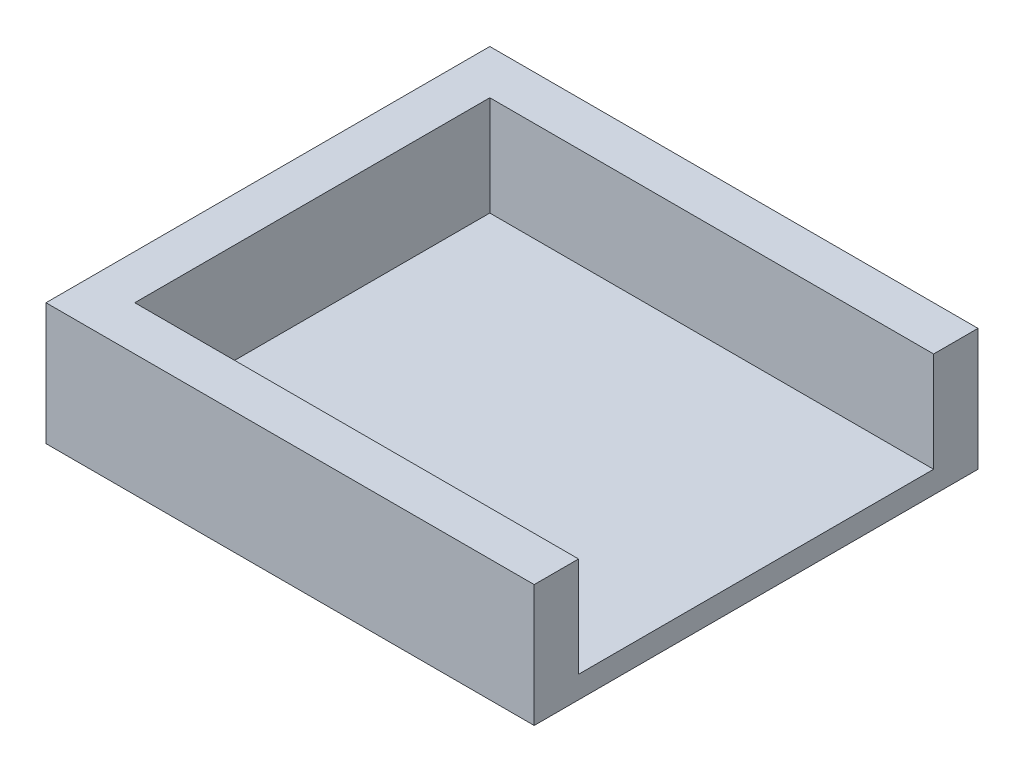
ISO-10303-21;
HEADER;
FILE_DESCRIPTION(('STEP AP214'),'2;1');
FILE_NAME('part.step','',(''),(''),'','','');
FILE_SCHEMA(('AUTOMOTIVE_DESIGN { 1 0 10303 214 1 1 1 1 }'));
ENDSEC;
DATA;
#1=APPLICATION_CONTEXT('core data for automotive mechanical design processes');
#2=APPLICATION_PROTOCOL_DEFINITION('international standard','automotive_design',2000,#1);
#3=PRODUCT_CONTEXT('',#1,'mechanical');
#4=PRODUCT('Part','Part','',(#3));
#5=PRODUCT_RELATED_PRODUCT_CATEGORY('part','',(#4));
#6=PRODUCT_DEFINITION_FORMATION('','',#4);
#7=PRODUCT_DEFINITION_CONTEXT('part definition',#1,'design');
#8=PRODUCT_DEFINITION('design','',#6,#7);
#9=PRODUCT_DEFINITION_SHAPE('','',#8);
#10=(LENGTH_UNIT() NAMED_UNIT(*) SI_UNIT(.MILLI.,.METRE.));
#11=(NAMED_UNIT(*) PLANE_ANGLE_UNIT() SI_UNIT($,.RADIAN.));
#12=(NAMED_UNIT(*) SI_UNIT($,.STERADIAN.) SOLID_ANGLE_UNIT());
#13=UNCERTAINTY_MEASURE_WITH_UNIT(LENGTH_MEASURE(1.E-05),#10,'distance_accuracy_value','');
#14=(GEOMETRIC_REPRESENTATION_CONTEXT(3) GLOBAL_UNCERTAINTY_ASSIGNED_CONTEXT((#13)) GLOBAL_UNIT_ASSIGNED_CONTEXT((#10,
#11,#12)) REPRESENTATION_CONTEXT('',''));
#15=CARTESIAN_POINT('',(0.,0.,0.));
#16=DIRECTION('',(0.,0.,1.));
#17=DIRECTION('',(1.,0.,0.));
#18=AXIS2_PLACEMENT_3D('',#15,#16,#17);
#19=CARTESIAN_POINT('',(-90.,45.,80.));
#20=DIRECTION('',(-1.,0.,0.));
#21=DIRECTION('',(0.,0.,1.));
#22=AXIS2_PLACEMENT_3D('',#19,#20,#21);
#23=PLANE('',#22);
#24=DIRECTION('',(0.,0.,-1.));
#25=VECTOR('',#24,1.);
#26=CARTESIAN_POINT('',(-90.,0.,80.));
#27=LINE('',#26,#25);
#28=CARTESIAN_POINT('',(-90.,0.,80.));
#29=VERTEX_POINT('',#28);
#30=CARTESIAN_POINT('',(-90.,0.,-80.));
#31=VERTEX_POINT('',#30);
#32=EDGE_CURVE('E125',#29,#31,#27,.T.);
#33=ORIENTED_EDGE('',*,*,#32,.T.);
#34=DIRECTION('',(0.,-1.,0.));
#35=VECTOR('',#34,1.);
#36=CARTESIAN_POINT('',(-90.,45.,-80.));
#37=LINE('',#36,#35);
#38=CARTESIAN_POINT('',(-90.,45.,-80.));
#39=VERTEX_POINT('',#38);
#40=EDGE_CURVE('E11',#39,#31,#37,.T.);
#41=ORIENTED_EDGE('',*,*,#40,.F.);
#42=DIRECTION('',(0.,0.,-1.));
#43=VECTOR('',#42,1.);
#44=CARTESIAN_POINT('',(-90.,45.,80.));
#45=LINE('',#44,#43);
#46=CARTESIAN_POINT('',(-90.,45.,80.));
#47=VERTEX_POINT('',#46);
#48=EDGE_CURVE('E127',#47,#39,#45,.T.);
#49=ORIENTED_EDGE('',*,*,#48,.F.);
#50=DIRECTION('',(0.,-1.,0.));
#51=VECTOR('',#50,1.);
#52=CARTESIAN_POINT('',(-90.,45.,80.));
#53=LINE('',#52,#51);
#54=EDGE_CURVE('E142',#47,#29,#53,.T.);
#55=ORIENTED_EDGE('',*,*,#54,.T.);
#56=EDGE_LOOP('',(#33,#41,#49,#55));
#57=FACE_BOUND('',#56,.T.);
#58=ADVANCED_FACE('F33',(#57),#23,.F.);
#59=CARTESIAN_POINT('',(-90.,45.,-80.));
#60=DIRECTION('',(0.,0.,-1.));
#61=DIRECTION('',(-1.,0.,0.));
#62=AXIS2_PLACEMENT_3D('',#59,#60,#61);
#63=PLANE('',#62);
#64=DIRECTION('',(1.,0.,0.));
#65=VECTOR('',#64,1.);
#66=CARTESIAN_POINT('',(-90.,0.,-80.));
#67=LINE('',#66,#65);
#68=CARTESIAN_POINT('',(110.,0.,-80.));
#69=VERTEX_POINT('',#68);
#70=EDGE_CURVE('E145',#31,#69,#67,.T.);
#71=ORIENTED_EDGE('',*,*,#70,.T.);
#72=DIRECTION('',(0.,-1.,0.));
#73=VECTOR('',#72,1.);
#74=CARTESIAN_POINT('',(110.,45.,-80.));
#75=LINE('',#74,#73);
#76=CARTESIAN_POINT('',(110.,45.,-80.));
#77=VERTEX_POINT('',#76);
#78=EDGE_CURVE('E41',#77,#69,#75,.T.);
#79=ORIENTED_EDGE('',*,*,#78,.F.);
#80=DIRECTION('',(1.,0.,0.));
#81=VECTOR('',#80,1.);
#82=CARTESIAN_POINT('',(-90.,45.,-80.));
#83=LINE('',#82,#81);
#84=EDGE_CURVE('E129',#39,#77,#83,.T.);
#85=ORIENTED_EDGE('',*,*,#84,.F.);
#86=ORIENTED_EDGE('',*,*,#40,.T.);
#87=EDGE_LOOP('',(#71,#79,#85,#86));
#88=FACE_BOUND('',#87,.T.);
#89=ADVANCED_FACE('F166',(#88),#63,.F.);
#90=CARTESIAN_POINT('',(-110.,45.,-100.));
#91=DIRECTION('',(0.,0.,1.));
#92=DIRECTION('',(1.,0.,0.));
#93=AXIS2_PLACEMENT_3D('',#90,#91,#92);
#94=PLANE('',#93);
#95=DIRECTION('',(0.,-1.,0.));
#96=VECTOR('',#95,1.);
#97=CARTESIAN_POINT('',(110.,45.,-100.));
#98=LINE('',#97,#96);
#99=CARTESIAN_POINT('',(110.,45.,-100.));
#100=VERTEX_POINT('',#99);
#101=CARTESIAN_POINT('',(110.,-10.,-100.));
#102=VERTEX_POINT('',#101);
#103=EDGE_CURVE('E103',#100,#102,#98,.T.);
#104=ORIENTED_EDGE('',*,*,#103,.T.);
#105=DIRECTION('',(1.,0.,0.));
#106=VECTOR('',#105,1.);
#107=CARTESIAN_POINT('',(-110.,-10.,-100.));
#108=LINE('',#107,#106);
#109=CARTESIAN_POINT('',(-110.,-10.,-100.));
#110=VERTEX_POINT('',#109);
#111=EDGE_CURVE('E107',#110,#102,#108,.T.);
#112=ORIENTED_EDGE('',*,*,#111,.F.);
#113=DIRECTION('',(0.,-1.,0.));
#114=VECTOR('',#113,1.);
#115=CARTESIAN_POINT('',(-110.,45.,-100.));
#116=LINE('',#115,#114);
#117=CARTESIAN_POINT('',(-110.,45.,-100.));
#118=VERTEX_POINT('',#117);
#119=EDGE_CURVE('E94',#118,#110,#116,.T.);
#120=ORIENTED_EDGE('',*,*,#119,.F.);
#121=DIRECTION('',(-1.,0.,0.));
#122=VECTOR('',#121,1.);
#123=CARTESIAN_POINT('',(-110.,45.,-100.));
#124=LINE('',#123,#122);
#125=EDGE_CURVE('E134',#100,#118,#124,.T.);
#126=ORIENTED_EDGE('',*,*,#125,.F.);
#127=EDGE_LOOP('',(#104,#112,#120,#126));
#128=FACE_BOUND('',#127,.T.);
#129=ADVANCED_FACE('F108',(#128),#94,.F.);
#130=CARTESIAN_POINT('',(-110.,45.,100.));
#131=DIRECTION('',(1.,0.,0.));
#132=DIRECTION('',(0.,0.,-1.));
#133=AXIS2_PLACEMENT_3D('',#130,#131,#132);
#134=PLANE('',#133);
#135=ORIENTED_EDGE('',*,*,#119,.T.);
#136=DIRECTION('',(0.,0.,-1.));
#137=VECTOR('',#136,1.);
#138=CARTESIAN_POINT('',(-110.,-10.,-100.));
#139=LINE('',#138,#137);
#140=CARTESIAN_POINT('',(-110.,-10.,100.));
#141=VERTEX_POINT('',#140);
#142=EDGE_CURVE('E99',#141,#110,#139,.T.);
#143=ORIENTED_EDGE('',*,*,#142,.F.);
#144=DIRECTION('',(0.,-1.,0.));
#145=VECTOR('',#144,1.);
#146=CARTESIAN_POINT('',(-110.,45.,100.));
#147=LINE('',#146,#145);
#148=CARTESIAN_POINT('',(-110.,45.,100.));
#149=VERTEX_POINT('',#148);
#150=EDGE_CURVE('E104',#149,#141,#147,.T.);
#151=ORIENTED_EDGE('',*,*,#150,.F.);
#152=DIRECTION('',(0.,0.,1.));
#153=VECTOR('',#152,1.);
#154=CARTESIAN_POINT('',(-110.,45.,100.));
#155=LINE('',#154,#153);
#156=EDGE_CURVE('E100',#118,#149,#155,.T.);
#157=ORIENTED_EDGE('',*,*,#156,.F.);
#158=EDGE_LOOP('',(#135,#143,#151,#157));
#159=FACE_BOUND('',#158,.T.);
#160=ADVANCED_FACE('F96',(#159),#134,.F.);
#161=CARTESIAN_POINT('',(-110.,45.,100.));
#162=DIRECTION('',(0.,0.,-1.));
#163=DIRECTION('',(-1.,0.,0.));
#164=AXIS2_PLACEMENT_3D('',#161,#162,#163);
#165=PLANE('',#164);
#166=ORIENTED_EDGE('',*,*,#150,.T.);
#167=DIRECTION('',(-1.,0.,0.));
#168=VECTOR('',#167,1.);
#169=CARTESIAN_POINT('',(-110.,-10.,100.));
#170=LINE('',#169,#168);
#171=CARTESIAN_POINT('',(110.,-10.,100.));
#172=VERTEX_POINT('',#171);
#173=EDGE_CURVE('E118',#172,#141,#170,.T.);
#174=ORIENTED_EDGE('',*,*,#173,.F.);
#175=DIRECTION('',(0.,-1.,0.));
#176=VECTOR('',#175,1.);
#177=CARTESIAN_POINT('',(110.,45.,100.));
#178=LINE('',#177,#176);
#179=CARTESIAN_POINT('',(110.,45.,100.));
#180=VERTEX_POINT('',#179);
#181=EDGE_CURVE('E155',#180,#172,#178,.T.);
#182=ORIENTED_EDGE('',*,*,#181,.F.);
#183=DIRECTION('',(1.,0.,0.));
#184=VECTOR('',#183,1.);
#185=CARTESIAN_POINT('',(-110.,45.,100.));
#186=LINE('',#185,#184);
#187=EDGE_CURVE('E137',#149,#180,#186,.T.);
#188=ORIENTED_EDGE('',*,*,#187,.F.);
#189=EDGE_LOOP('',(#166,#174,#182,#188));
#190=FACE_BOUND('',#189,.T.);
#191=ADVANCED_FACE('F178',(#190),#165,.F.);
#192=CARTESIAN_POINT('',(110.,45.,100.));
#193=DIRECTION('',(-1.,0.,0.));
#194=DIRECTION('',(0.,0.,1.));
#195=AXIS2_PLACEMENT_3D('',#192,#193,#194);
#196=PLANE('',#195);
#197=ORIENTED_EDGE('',*,*,#181,.T.);
#198=DIRECTION('',(0.,0.,1.));
#199=VECTOR('',#198,1.);
#200=CARTESIAN_POINT('',(110.,-10.,-100.));
#201=LINE('',#200,#199);
#202=EDGE_CURVE('E113',#102,#172,#201,.T.);
#203=ORIENTED_EDGE('',*,*,#202,.F.);
#204=ORIENTED_EDGE('',*,*,#103,.F.);
#205=DIRECTION('',(0.,0.,-1.));
#206=VECTOR('',#205,1.);
#207=CARTESIAN_POINT('',(110.,45.,-80.));
#208=LINE('',#207,#206);
#209=EDGE_CURVE('E132',#77,#100,#208,.T.);
#210=ORIENTED_EDGE('',*,*,#209,.F.);
#211=ORIENTED_EDGE('',*,*,#78,.T.);
#212=DIRECTION('',(0.,0.,1.));
#213=VECTOR('',#212,1.);
#214=CARTESIAN_POINT('',(110.,0.,-100.));
#215=LINE('',#214,#213);
#216=CARTESIAN_POINT('',(110.,0.,80.));
#217=VERTEX_POINT('',#216);
#218=EDGE_CURVE('E119',#69,#217,#215,.T.);
#219=ORIENTED_EDGE('',*,*,#218,.T.);
#220=DIRECTION('',(0.,-1.,0.));
#221=VECTOR('',#220,1.);
#222=CARTESIAN_POINT('',(110.,45.,80.));
#223=LINE('',#222,#221);
#224=CARTESIAN_POINT('',(110.,45.,80.));
#225=VERTEX_POINT('',#224);
#226=EDGE_CURVE('E152',#225,#217,#223,.T.);
#227=ORIENTED_EDGE('',*,*,#226,.F.);
#228=DIRECTION('',(0.,0.,-1.));
#229=VECTOR('',#228,1.);
#230=CARTESIAN_POINT('',(110.,45.,100.));
#231=LINE('',#230,#229);
#232=EDGE_CURVE('E139',#180,#225,#231,.T.);
#233=ORIENTED_EDGE('',*,*,#232,.F.);
#234=EDGE_LOOP('',(#197,#203,#204,#210,#211,#219,#227,#233));
#235=FACE_BOUND('',#234,.T.);
#236=ADVANCED_FACE('F162',(#235),#196,.F.);
#237=CARTESIAN_POINT('',(-90.,45.,80.));
#238=DIRECTION('',(0.,0.,1.));
#239=DIRECTION('',(1.,0.,0.));
#240=AXIS2_PLACEMENT_3D('',#237,#238,#239);
#241=PLANE('',#240);
#242=DIRECTION('',(-1.,0.,0.));
#243=VECTOR('',#242,1.);
#244=CARTESIAN_POINT('',(-90.,0.,80.));
#245=LINE('',#244,#243);
#246=EDGE_CURVE('E130',#217,#29,#245,.T.);
#247=ORIENTED_EDGE('',*,*,#246,.T.);
#248=ORIENTED_EDGE('',*,*,#54,.F.);
#249=DIRECTION('',(-1.,0.,0.));
#250=VECTOR('',#249,1.);
#251=CARTESIAN_POINT('',(-90.,45.,80.));
#252=LINE('',#251,#250);
#253=EDGE_CURVE('E48',#225,#47,#252,.T.);
#254=ORIENTED_EDGE('',*,*,#253,.F.);
#255=ORIENTED_EDGE('',*,*,#226,.T.);
#256=EDGE_LOOP('',(#247,#248,#254,#255));
#257=FACE_BOUND('',#256,.T.);
#258=ADVANCED_FACE('F171',(#257),#241,.F.);
#259=CARTESIAN_POINT('',(0.,45.,0.));
#260=DIRECTION('',(0.,-1.,0.));
#261=DIRECTION('',(0.,0.,-1.));
#262=AXIS2_PLACEMENT_3D('',#259,#260,#261);
#263=PLANE('',#262);
#264=ORIENTED_EDGE('',*,*,#48,.T.);
#265=ORIENTED_EDGE('',*,*,#84,.T.);
#266=ORIENTED_EDGE('',*,*,#209,.T.);
#267=ORIENTED_EDGE('',*,*,#125,.T.);
#268=ORIENTED_EDGE('',*,*,#156,.T.);
#269=ORIENTED_EDGE('',*,*,#187,.T.);
#270=ORIENTED_EDGE('',*,*,#232,.T.);
#271=ORIENTED_EDGE('',*,*,#253,.T.);
#272=EDGE_LOOP('',(#264,#265,#266,#267,#268,#269,#270,#271));
#273=FACE_BOUND('',#272,.T.);
#274=ADVANCED_FACE('F174',(#273),#263,.F.);
#275=CARTESIAN_POINT('',(0.,0.,0.));
#276=DIRECTION('',(0.,1.,0.));
#277=DIRECTION('',(0.,0.,1.));
#278=AXIS2_PLACEMENT_3D('',#275,#276,#277);
#279=PLANE('',#278);
#280=ORIENTED_EDGE('',*,*,#246,.F.);
#281=ORIENTED_EDGE('',*,*,#218,.F.);
#282=ORIENTED_EDGE('',*,*,#70,.F.);
#283=ORIENTED_EDGE('',*,*,#32,.F.);
#284=EDGE_LOOP('',(#280,#281,#282,#283));
#285=FACE_BOUND('',#284,.T.);
#286=ADVANCED_FACE('F169',(#285),#279,.T.);
#287=CARTESIAN_POINT('',(0.,-10.,0.));
#288=DIRECTION('',(0.,1.,0.));
#289=DIRECTION('',(0.,0.,1.));
#290=AXIS2_PLACEMENT_3D('',#287,#288,#289);
#291=PLANE('',#290);
#292=ORIENTED_EDGE('',*,*,#142,.T.);
#293=ORIENTED_EDGE('',*,*,#111,.T.);
#294=ORIENTED_EDGE('',*,*,#202,.T.);
#295=ORIENTED_EDGE('',*,*,#173,.T.);
#296=EDGE_LOOP('',(#292,#293,#294,#295));
#297=FACE_BOUND('',#296,.T.);
#298=ADVANCED_FACE('F116',(#297),#291,.F.);
#299=CLOSED_SHELL('',(#58,#89,#129,#160,#191,#236,#258,#274,#286,#298));
#300=MANIFOLD_SOLID_BREP('B2',#299);
#301=ADVANCED_BREP_SHAPE_REPRESENTATION('',(#18,#300),#14);
#302=SHAPE_DEFINITION_REPRESENTATION(#9,#301);
ENDSEC;
END-ISO-10303-21;
